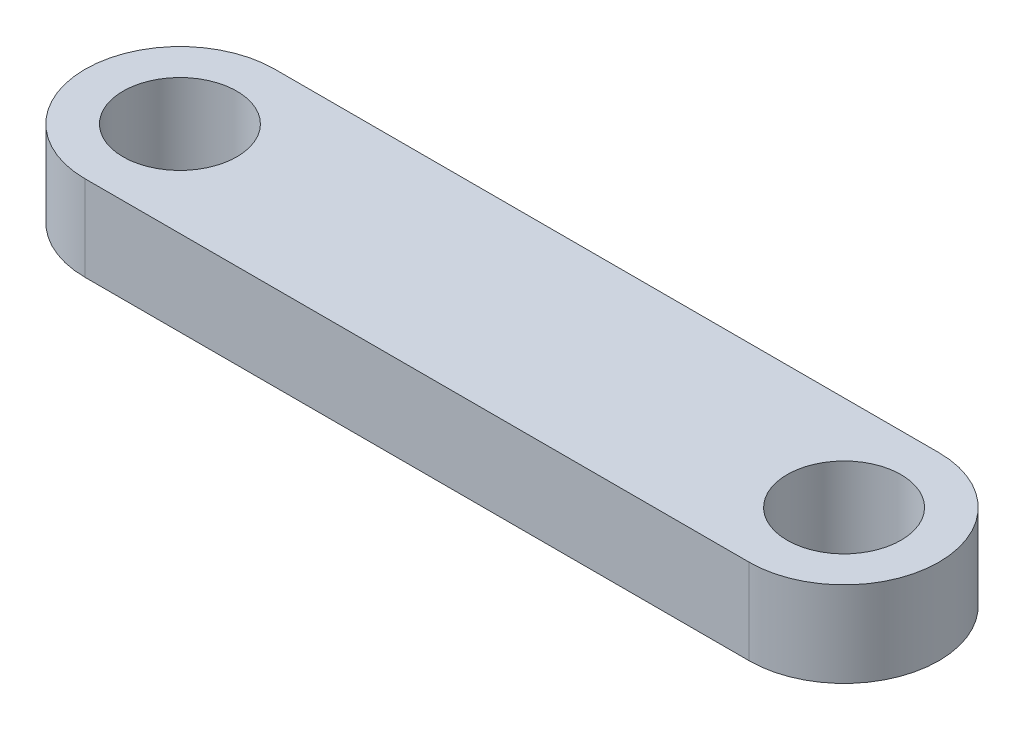
ISO-10303-21;
HEADER;
FILE_DESCRIPTION(('STEP AP214'),'2;1');
FILE_NAME('part.step','',(''),(''),'','','');
FILE_SCHEMA(('AUTOMOTIVE_DESIGN { 1 0 10303 214 1 1 1 1 }'));
ENDSEC;
DATA;
#1=APPLICATION_CONTEXT('core data for automotive mechanical design processes');
#2=APPLICATION_PROTOCOL_DEFINITION('international standard','automotive_design',2000,#1);
#3=PRODUCT_CONTEXT('',#1,'mechanical');
#4=PRODUCT('Part','Part','',(#3));
#5=PRODUCT_RELATED_PRODUCT_CATEGORY('part','',(#4));
#6=PRODUCT_DEFINITION_FORMATION('','',#4);
#7=PRODUCT_DEFINITION_CONTEXT('part definition',#1,'design');
#8=PRODUCT_DEFINITION('design','',#6,#7);
#9=PRODUCT_DEFINITION_SHAPE('','',#8);
#10=(LENGTH_UNIT() NAMED_UNIT(*) SI_UNIT(.MILLI.,.METRE.));
#11=(NAMED_UNIT(*) PLANE_ANGLE_UNIT() SI_UNIT($,.RADIAN.));
#12=(NAMED_UNIT(*) SI_UNIT($,.STERADIAN.) SOLID_ANGLE_UNIT());
#13=UNCERTAINTY_MEASURE_WITH_UNIT(LENGTH_MEASURE(1.E-05),#10,'distance_accuracy_value','');
#14=(GEOMETRIC_REPRESENTATION_CONTEXT(3) GLOBAL_UNCERTAINTY_ASSIGNED_CONTEXT((#13)) GLOBAL_UNIT_ASSIGNED_CONTEXT((#10,
#11,#12)) REPRESENTATION_CONTEXT('',''));
#15=CARTESIAN_POINT('',(0.,0.,0.));
#16=DIRECTION('',(0.,0.,1.));
#17=DIRECTION('',(1.,0.,0.));
#18=AXIS2_PLACEMENT_3D('',#15,#16,#17);
#19=CARTESIAN_POINT('',(25.,4.5,0.));
#20=DIRECTION('',(0.,1.,0.));
#21=DIRECTION('',(0.,0.,1.));
#22=AXIS2_PLACEMENT_3D('',#19,#20,#21);
#23=PLANE('',#22);
#24=CARTESIAN_POINT('',(-10.,4.5,0.));
#25=DIRECTION('',(0.,1.,0.));
#26=DIRECTION('',(0.,0.,1.));
#27=AXIS2_PLACEMENT_3D('',#24,#25,#26);
#28=CIRCLE('',#27,3.);
#29=CARTESIAN_POINT('',(-10.,4.5,3.));
#30=VERTEX_POINT('',#29);
#31=EDGE_CURVE('E107',#30,#30,#28,.T.);
#32=ORIENTED_EDGE('',*,*,#31,.F.);
#33=EDGE_LOOP('',(#32));
#34=FACE_BOUND('',#33,.T.);
#35=CARTESIAN_POINT('',(25.,4.5,0.));
#36=DIRECTION('',(0.,1.,0.));
#37=DIRECTION('',(0.,0.,1.));
#38=AXIS2_PLACEMENT_3D('',#35,#36,#37);
#39=CIRCLE('',#38,5.);
#40=CARTESIAN_POINT('',(25.,4.5,5.));
#41=VERTEX_POINT('',#40);
#42=CARTESIAN_POINT('',(25.,4.5,-5.));
#43=VERTEX_POINT('',#42);
#44=EDGE_CURVE('E93',#41,#43,#39,.T.);
#45=ORIENTED_EDGE('',*,*,#44,.T.);
#46=DIRECTION('',(-1.,0.,0.));
#47=VECTOR('',#46,1.);
#48=CARTESIAN_POINT('',(-10.,4.5,-5.));
#49=LINE('',#48,#47);
#50=CARTESIAN_POINT('',(-10.,4.5,-5.));
#51=VERTEX_POINT('',#50);
#52=EDGE_CURVE('E88',#43,#51,#49,.T.);
#53=ORIENTED_EDGE('',*,*,#52,.T.);
#54=CARTESIAN_POINT('',(-10.,4.5,0.));
#55=DIRECTION('',(0.,1.,0.));
#56=DIRECTION('',(0.,0.,1.));
#57=AXIS2_PLACEMENT_3D('',#54,#55,#56);
#58=CIRCLE('',#57,5.);
#59=CARTESIAN_POINT('',(-10.,4.5,5.));
#60=VERTEX_POINT('',#59);
#61=EDGE_CURVE('E91',#51,#60,#58,.T.);
#62=ORIENTED_EDGE('',*,*,#61,.T.);
#63=DIRECTION('',(1.,0.,0.));
#64=VECTOR('',#63,1.);
#65=CARTESIAN_POINT('',(-10.,4.5,5.));
#66=LINE('',#65,#64);
#67=EDGE_CURVE('E59',#60,#41,#66,.T.);
#68=ORIENTED_EDGE('',*,*,#67,.T.);
#69=EDGE_LOOP('',(#45,#53,#62,#68));
#70=FACE_BOUND('',#69,.T.);
#71=CARTESIAN_POINT('',(25.,4.5,0.));
#72=DIRECTION('',(0.,1.,0.));
#73=DIRECTION('',(0.,0.,1.));
#74=AXIS2_PLACEMENT_3D('',#71,#72,#73);
#75=CIRCLE('',#74,3.);
#76=CARTESIAN_POINT('',(25.,4.5,3.));
#77=VERTEX_POINT('',#76);
#78=EDGE_CURVE('E121',#77,#77,#75,.T.);
#79=ORIENTED_EDGE('',*,*,#78,.F.);
#80=EDGE_LOOP('',(#79));
#81=FACE_BOUND('',#80,.T.);
#82=ADVANCED_FACE('F41',(#34,#70,#81),#23,.T.);
#83=CARTESIAN_POINT('',(25.,0.,0.));
#84=DIRECTION('',(0.,1.,0.));
#85=DIRECTION('',(0.,0.,1.));
#86=AXIS2_PLACEMENT_3D('',#83,#84,#85);
#87=PLANE('',#86);
#88=CARTESIAN_POINT('',(25.,0.,0.));
#89=DIRECTION('',(0.,1.,0.));
#90=DIRECTION('',(0.,0.,1.));
#91=AXIS2_PLACEMENT_3D('',#88,#89,#90);
#92=CIRCLE('',#91,5.);
#93=CARTESIAN_POINT('',(25.,0.,5.));
#94=VERTEX_POINT('',#93);
#95=CARTESIAN_POINT('',(25.,0.,-5.));
#96=VERTEX_POINT('',#95);
#97=EDGE_CURVE('E103',#94,#96,#92,.T.);
#98=ORIENTED_EDGE('',*,*,#97,.F.);
#99=DIRECTION('',(1.,0.,0.));
#100=VECTOR('',#99,1.);
#101=CARTESIAN_POINT('',(-10.,0.,5.));
#102=LINE('',#101,#100);
#103=CARTESIAN_POINT('',(-10.,0.,5.));
#104=VERTEX_POINT('',#103);
#105=EDGE_CURVE('E83',#104,#94,#102,.T.);
#106=ORIENTED_EDGE('',*,*,#105,.F.);
#107=CARTESIAN_POINT('',(-10.,0.,0.));
#108=DIRECTION('',(0.,1.,0.));
#109=DIRECTION('',(0.,0.,1.));
#110=AXIS2_PLACEMENT_3D('',#107,#108,#109);
#111=CIRCLE('',#110,5.);
#112=CARTESIAN_POINT('',(-10.,0.,-5.));
#113=VERTEX_POINT('',#112);
#114=EDGE_CURVE('E71',#113,#104,#111,.T.);
#115=ORIENTED_EDGE('',*,*,#114,.F.);
#116=DIRECTION('',(-1.,0.,0.));
#117=VECTOR('',#116,1.);
#118=CARTESIAN_POINT('',(-10.,0.,-5.));
#119=LINE('',#118,#117);
#120=EDGE_CURVE('E100',#96,#113,#119,.T.);
#121=ORIENTED_EDGE('',*,*,#120,.F.);
#122=EDGE_LOOP('',(#98,#106,#115,#121));
#123=FACE_BOUND('',#122,.T.);
#124=CARTESIAN_POINT('',(-10.,0.,0.));
#125=DIRECTION('',(0.,1.,0.));
#126=DIRECTION('',(0.,0.,1.));
#127=AXIS2_PLACEMENT_3D('',#124,#125,#126);
#128=CIRCLE('',#127,3.);
#129=CARTESIAN_POINT('',(-10.,0.,3.));
#130=VERTEX_POINT('',#129);
#131=EDGE_CURVE('E116',#130,#130,#128,.T.);
#132=ORIENTED_EDGE('',*,*,#131,.T.);
#133=EDGE_LOOP('',(#132));
#134=FACE_BOUND('',#133,.T.);
#135=CARTESIAN_POINT('',(25.,0.,0.));
#136=DIRECTION('',(0.,1.,0.));
#137=DIRECTION('',(0.,0.,1.));
#138=AXIS2_PLACEMENT_3D('',#135,#136,#137);
#139=CIRCLE('',#138,3.);
#140=CARTESIAN_POINT('',(25.,0.,3.));
#141=VERTEX_POINT('',#140);
#142=EDGE_CURVE('E128',#141,#141,#139,.T.);
#143=ORIENTED_EDGE('',*,*,#142,.T.);
#144=EDGE_LOOP('',(#143));
#145=FACE_BOUND('',#144,.T.);
#146=ADVANCED_FACE('F118',(#123,#134,#145),#87,.F.);
#147=CARTESIAN_POINT('',(25.,4.5,0.));
#148=DIRECTION('',(0.,-1.,0.));
#149=DIRECTION('',(0.,0.,-1.));
#150=AXIS2_PLACEMENT_3D('',#147,#148,#149);
#151=CYLINDRICAL_SURFACE('',#150,5.);
#152=ORIENTED_EDGE('',*,*,#97,.T.);
#153=DIRECTION('',(0.,-1.,0.));
#154=VECTOR('',#153,1.);
#155=CARTESIAN_POINT('',(25.,4.5,-5.));
#156=LINE('',#155,#154);
#157=EDGE_CURVE('E11',#43,#96,#156,.T.);
#158=ORIENTED_EDGE('',*,*,#157,.F.);
#159=ORIENTED_EDGE('',*,*,#44,.F.);
#160=DIRECTION('',(0.,-1.,0.));
#161=VECTOR('',#160,1.);
#162=CARTESIAN_POINT('',(25.,4.5,5.));
#163=LINE('',#162,#161);
#164=EDGE_CURVE('E102',#41,#94,#163,.T.);
#165=ORIENTED_EDGE('',*,*,#164,.T.);
#166=EDGE_LOOP('',(#152,#158,#159,#165));
#167=FACE_BOUND('',#166,.T.);
#168=ADVANCED_FACE('F43',(#167),#151,.T.);
#169=CARTESIAN_POINT('',(-10.,4.5,-5.));
#170=DIRECTION('',(0.,0.,1.));
#171=DIRECTION('',(1.,0.,0.));
#172=AXIS2_PLACEMENT_3D('',#169,#170,#171);
#173=PLANE('',#172);
#174=ORIENTED_EDGE('',*,*,#120,.T.);
#175=DIRECTION('',(0.,-1.,0.));
#176=VECTOR('',#175,1.);
#177=CARTESIAN_POINT('',(-10.,4.5,-5.));
#178=LINE('',#177,#176);
#179=EDGE_CURVE('E49',#51,#113,#178,.T.);
#180=ORIENTED_EDGE('',*,*,#179,.F.);
#181=ORIENTED_EDGE('',*,*,#52,.F.);
#182=ORIENTED_EDGE('',*,*,#157,.T.);
#183=EDGE_LOOP('',(#174,#180,#181,#182));
#184=FACE_BOUND('',#183,.T.);
#185=ADVANCED_FACE('F96',(#184),#173,.F.);
#186=CARTESIAN_POINT('',(-10.,4.5,0.));
#187=DIRECTION('',(0.,-1.,0.));
#188=DIRECTION('',(0.,0.,-1.));
#189=AXIS2_PLACEMENT_3D('',#186,#187,#188);
#190=CYLINDRICAL_SURFACE('',#189,5.);
#191=ORIENTED_EDGE('',*,*,#114,.T.);
#192=DIRECTION('',(0.,-1.,0.));
#193=VECTOR('',#192,1.);
#194=CARTESIAN_POINT('',(-10.,4.5,5.));
#195=LINE('',#194,#193);
#196=EDGE_CURVE('E97',#60,#104,#195,.T.);
#197=ORIENTED_EDGE('',*,*,#196,.F.);
#198=ORIENTED_EDGE('',*,*,#61,.F.);
#199=ORIENTED_EDGE('',*,*,#179,.T.);
#200=EDGE_LOOP('',(#191,#197,#198,#199));
#201=FACE_BOUND('',#200,.T.);
#202=ADVANCED_FACE('F98',(#201),#190,.T.);
#203=CARTESIAN_POINT('',(-10.,4.5,5.));
#204=DIRECTION('',(0.,0.,-1.));
#205=DIRECTION('',(-1.,0.,0.));
#206=AXIS2_PLACEMENT_3D('',#203,#204,#205);
#207=PLANE('',#206);
#208=ORIENTED_EDGE('',*,*,#105,.T.);
#209=ORIENTED_EDGE('',*,*,#164,.F.);
#210=ORIENTED_EDGE('',*,*,#67,.F.);
#211=ORIENTED_EDGE('',*,*,#196,.T.);
#212=EDGE_LOOP('',(#208,#209,#210,#211));
#213=FACE_BOUND('',#212,.T.);
#214=ADVANCED_FACE('F111',(#213),#207,.F.);
#215=CARTESIAN_POINT('',(-10.,4.5,0.));
#216=DIRECTION('',(0.,-1.,0.));
#217=DIRECTION('',(0.,0.,-1.));
#218=AXIS2_PLACEMENT_3D('',#215,#216,#217);
#219=CYLINDRICAL_SURFACE('',#218,3.);
#220=ORIENTED_EDGE('',*,*,#31,.T.);
#221=EDGE_LOOP('',(#220));
#222=FACE_BOUND('',#221,.T.);
#223=ORIENTED_EDGE('',*,*,#131,.F.);
#224=EDGE_LOOP('',(#223));
#225=FACE_BOUND('',#224,.T.);
#226=ADVANCED_FACE('F142',(#222,#225),#219,.F.);
#227=CARTESIAN_POINT('',(25.,4.5,0.));
#228=DIRECTION('',(0.,-1.,0.));
#229=DIRECTION('',(0.,0.,-1.));
#230=AXIS2_PLACEMENT_3D('',#227,#228,#229);
#231=CYLINDRICAL_SURFACE('',#230,3.);
#232=ORIENTED_EDGE('',*,*,#78,.T.);
#233=EDGE_LOOP('',(#232));
#234=FACE_BOUND('',#233,.T.);
#235=ORIENTED_EDGE('',*,*,#142,.F.);
#236=EDGE_LOOP('',(#235));
#237=FACE_BOUND('',#236,.T.);
#238=ADVANCED_FACE('F135',(#234,#237),#231,.F.);
#239=CLOSED_SHELL('',(#82,#146,#168,#185,#202,#214,#226,#238));
#240=MANIFOLD_SOLID_BREP('B2',#239);
#241=ADVANCED_BREP_SHAPE_REPRESENTATION('',(#18,#240),#14);
#242=SHAPE_DEFINITION_REPRESENTATION(#9,#241);
ENDSEC;
END-ISO-10303-21;
